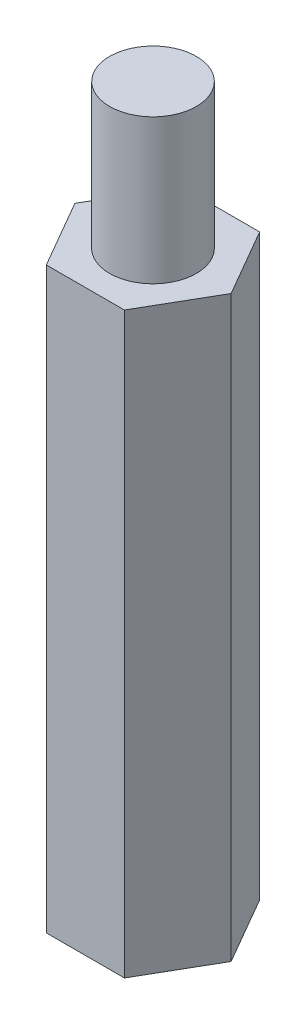
ISO-10303-21;
HEADER;
FILE_DESCRIPTION(('STEP AP214'),'2;1');
FILE_NAME('part.step','',(''),(''),'','','');
FILE_SCHEMA(('AUTOMOTIVE_DESIGN { 1 0 10303 214 1 1 1 1 }'));
ENDSEC;
DATA;
#1=APPLICATION_CONTEXT('core data for automotive mechanical design processes');
#2=APPLICATION_PROTOCOL_DEFINITION('international standard','automotive_design',2000,#1);
#3=PRODUCT_CONTEXT('',#1,'mechanical');
#4=PRODUCT('Part','Part','',(#3));
#5=PRODUCT_RELATED_PRODUCT_CATEGORY('part','',(#4));
#6=PRODUCT_DEFINITION_FORMATION('','',#4);
#7=PRODUCT_DEFINITION_CONTEXT('part definition',#1,'design');
#8=PRODUCT_DEFINITION('design','',#6,#7);
#9=PRODUCT_DEFINITION_SHAPE('','',#8);
#10=(LENGTH_UNIT() NAMED_UNIT(*) SI_UNIT(.MILLI.,.METRE.));
#11=(NAMED_UNIT(*) PLANE_ANGLE_UNIT() SI_UNIT($,.RADIAN.));
#12=(NAMED_UNIT(*) SI_UNIT($,.STERADIAN.) SOLID_ANGLE_UNIT());
#13=UNCERTAINTY_MEASURE_WITH_UNIT(LENGTH_MEASURE(1.E-05),#10,'distance_accuracy_value','');
#14=(GEOMETRIC_REPRESENTATION_CONTEXT(3) GLOBAL_UNCERTAINTY_ASSIGNED_CONTEXT((#13)) GLOBAL_UNIT_ASSIGNED_CONTEXT((#10,
#11,#12)) REPRESENTATION_CONTEXT('',''));
#15=CARTESIAN_POINT('',(0.,0.,0.));
#16=DIRECTION('',(0.,0.,1.));
#17=DIRECTION('',(1.,0.,0.));
#18=AXIS2_PLACEMENT_3D('',#15,#16,#17);
#19=CARTESIAN_POINT('',(1.35,20.,2.33826859021799));
#20=DIRECTION('',(-0.866025403784439,0.,-0.5));
#21=DIRECTION('',(-0.5,0.,0.866025403784439));
#22=AXIS2_PLACEMENT_3D('',#19,#20,#21);
#23=PLANE('',#22);
#24=DIRECTION('',(0.5,0.,-0.866025403784439));
#25=VECTOR('',#24,1.);
#26=CARTESIAN_POINT('',(1.35,0.,2.33826859021799));
#27=LINE('',#26,#25);
#28=CARTESIAN_POINT('',(1.35,0.,2.33826859021799));
#29=VERTEX_POINT('',#28);
#30=CARTESIAN_POINT('',(2.7,0.,0.));
#31=VERTEX_POINT('',#30);
#32=EDGE_CURVE('E123',#29,#31,#27,.T.);
#33=ORIENTED_EDGE('',*,*,#32,.T.);
#34=DIRECTION('',(0.,-1.,0.));
#35=VECTOR('',#34,1.);
#36=CARTESIAN_POINT('',(2.7,20.,0.));
#37=LINE('',#36,#35);
#38=CARTESIAN_POINT('',(2.7,20.,0.));
#39=VERTEX_POINT('',#38);
#40=EDGE_CURVE('E11',#39,#31,#37,.T.);
#41=ORIENTED_EDGE('',*,*,#40,.F.);
#42=DIRECTION('',(0.5,0.,-0.866025403784439));
#43=VECTOR('',#42,1.);
#44=CARTESIAN_POINT('',(1.35,20.,2.33826859021799));
#45=LINE('',#44,#43);
#46=CARTESIAN_POINT('',(1.35,20.,2.33826859021799));
#47=VERTEX_POINT('',#46);
#48=EDGE_CURVE('E134',#47,#39,#45,.T.);
#49=ORIENTED_EDGE('',*,*,#48,.F.);
#50=DIRECTION('',(0.,-1.,0.));
#51=VECTOR('',#50,1.);
#52=CARTESIAN_POINT('',(1.35,20.,2.33826859021799));
#53=LINE('',#52,#51);
#54=EDGE_CURVE('E119',#47,#29,#53,.T.);
#55=ORIENTED_EDGE('',*,*,#54,.T.);
#56=EDGE_LOOP('',(#33,#41,#49,#55));
#57=FACE_BOUND('',#56,.T.);
#58=ADVANCED_FACE('F38',(#57),#23,.F.);
#59=CARTESIAN_POINT('',(2.7,20.,0.));
#60=DIRECTION('',(-0.866025403784439,0.,0.5));
#61=DIRECTION('',(0.5,0.,0.866025403784439));
#62=AXIS2_PLACEMENT_3D('',#59,#60,#61);
#63=PLANE('',#62);
#64=DIRECTION('',(-0.5,0.,-0.866025403784438));
#65=VECTOR('',#64,1.);
#66=CARTESIAN_POINT('',(2.7,0.,0.));
#67=LINE('',#66,#65);
#68=CARTESIAN_POINT('',(1.35,0.,-2.33826859021799));
#69=VERTEX_POINT('',#68);
#70=EDGE_CURVE('E126',#31,#69,#67,.T.);
#71=ORIENTED_EDGE('',*,*,#70,.T.);
#72=DIRECTION('',(0.,-1.,0.));
#73=VECTOR('',#72,1.);
#74=CARTESIAN_POINT('',(1.35,20.,-2.33826859021799));
#75=LINE('',#74,#73);
#76=CARTESIAN_POINT('',(1.35,20.,-2.33826859021799));
#77=VERTEX_POINT('',#76);
#78=EDGE_CURVE('E47',#77,#69,#75,.T.);
#79=ORIENTED_EDGE('',*,*,#78,.F.);
#80=DIRECTION('',(-0.5,0.,-0.866025403784438));
#81=VECTOR('',#80,1.);
#82=CARTESIAN_POINT('',(2.7,20.,0.));
#83=LINE('',#82,#81);
#84=EDGE_CURVE('E92',#39,#77,#83,.T.);
#85=ORIENTED_EDGE('',*,*,#84,.F.);
#86=ORIENTED_EDGE('',*,*,#40,.T.);
#87=EDGE_LOOP('',(#71,#79,#85,#86));
#88=FACE_BOUND('',#87,.T.);
#89=ADVANCED_FACE('F160',(#88),#63,.F.);
#90=CARTESIAN_POINT('',(1.35,20.,-2.33826859021799));
#91=DIRECTION('',(0.,0.,1.));
#92=DIRECTION('',(1.,0.,0.));
#93=AXIS2_PLACEMENT_3D('',#90,#91,#92);
#94=PLANE('',#93);
#95=DIRECTION('',(-1.,0.,0.));
#96=VECTOR('',#95,1.);
#97=CARTESIAN_POINT('',(1.35,0.,-2.33826859021799));
#98=LINE('',#97,#96);
#99=CARTESIAN_POINT('',(-1.35,0.,-2.33826859021799));
#100=VERTEX_POINT('',#99);
#101=EDGE_CURVE('E129',#69,#100,#98,.T.);
#102=ORIENTED_EDGE('',*,*,#101,.T.);
#103=DIRECTION('',(0.,-1.,0.));
#104=VECTOR('',#103,1.);
#105=CARTESIAN_POINT('',(-1.35,20.,-2.33826859021799));
#106=LINE('',#105,#104);
#107=CARTESIAN_POINT('',(-1.35,20.,-2.33826859021799));
#108=VERTEX_POINT('',#107);
#109=EDGE_CURVE('E114',#108,#100,#106,.T.);
#110=ORIENTED_EDGE('',*,*,#109,.F.);
#111=DIRECTION('',(-1.,0.,0.));
#112=VECTOR('',#111,1.);
#113=CARTESIAN_POINT('',(1.35,20.,-2.33826859021799));
#114=LINE('',#113,#112);
#115=EDGE_CURVE('E105',#77,#108,#114,.T.);
#116=ORIENTED_EDGE('',*,*,#115,.F.);
#117=ORIENTED_EDGE('',*,*,#78,.T.);
#118=EDGE_LOOP('',(#102,#110,#116,#117));
#119=FACE_BOUND('',#118,.T.);
#120=ADVANCED_FACE('F141',(#119),#94,.F.);
#121=CARTESIAN_POINT('',(-1.35,20.,-2.33826859021799));
#122=DIRECTION('',(0.866025403784439,0.,0.5));
#123=DIRECTION('',(0.5,0.,-0.866025403784439));
#124=AXIS2_PLACEMENT_3D('',#121,#122,#123);
#125=PLANE('',#124);
#126=DIRECTION('',(-0.5,0.,0.866025403784439));
#127=VECTOR('',#126,1.);
#128=CARTESIAN_POINT('',(-1.35,0.,-2.33826859021799));
#129=LINE('',#128,#127);
#130=CARTESIAN_POINT('',(-2.7,0.,0.));
#131=VERTEX_POINT('',#130);
#132=EDGE_CURVE('E113',#100,#131,#129,.T.);
#133=ORIENTED_EDGE('',*,*,#132,.T.);
#134=DIRECTION('',(0.,-1.,0.));
#135=VECTOR('',#134,1.);
#136=CARTESIAN_POINT('',(-2.7,20.,0.));
#137=LINE('',#136,#135);
#138=CARTESIAN_POINT('',(-2.7,20.,0.));
#139=VERTEX_POINT('',#138);
#140=EDGE_CURVE('E110',#139,#131,#137,.T.);
#141=ORIENTED_EDGE('',*,*,#140,.F.);
#142=DIRECTION('',(-0.5,0.,0.866025403784439));
#143=VECTOR('',#142,1.);
#144=CARTESIAN_POINT('',(-1.35,20.,-2.33826859021799));
#145=LINE('',#144,#143);
#146=EDGE_CURVE('E99',#108,#139,#145,.T.);
#147=ORIENTED_EDGE('',*,*,#146,.F.);
#148=ORIENTED_EDGE('',*,*,#109,.T.);
#149=EDGE_LOOP('',(#133,#141,#147,#148));
#150=FACE_BOUND('',#149,.T.);
#151=ADVANCED_FACE('F111',(#150),#125,.F.);
#152=CARTESIAN_POINT('',(-2.7,20.,0.));
#153=DIRECTION('',(0.866025403784439,0.,-0.5));
#154=DIRECTION('',(-0.5,0.,-0.866025403784439));
#155=AXIS2_PLACEMENT_3D('',#152,#153,#154);
#156=PLANE('',#155);
#157=DIRECTION('',(0.5,0.,0.866025403784439));
#158=VECTOR('',#157,1.);
#159=CARTESIAN_POINT('',(-2.7,0.,0.));
#160=LINE('',#159,#158);
#161=CARTESIAN_POINT('',(-1.35,0.,2.33826859021799));
#162=VERTEX_POINT('',#161);
#163=EDGE_CURVE('E78',#131,#162,#160,.T.);
#164=ORIENTED_EDGE('',*,*,#163,.T.);
#165=DIRECTION('',(0.,-1.,0.));
#166=VECTOR('',#165,1.);
#167=CARTESIAN_POINT('',(-1.35,20.,2.33826859021799));
#168=LINE('',#167,#166);
#169=CARTESIAN_POINT('',(-1.35,20.,2.33826859021799));
#170=VERTEX_POINT('',#169);
#171=EDGE_CURVE('E115',#170,#162,#168,.T.);
#172=ORIENTED_EDGE('',*,*,#171,.F.);
#173=DIRECTION('',(0.5,0.,0.866025403784439));
#174=VECTOR('',#173,1.);
#175=CARTESIAN_POINT('',(-2.7,20.,0.));
#176=LINE('',#175,#174);
#177=EDGE_CURVE('E103',#139,#170,#176,.T.);
#178=ORIENTED_EDGE('',*,*,#177,.F.);
#179=ORIENTED_EDGE('',*,*,#140,.T.);
#180=EDGE_LOOP('',(#164,#172,#178,#179));
#181=FACE_BOUND('',#180,.T.);
#182=ADVANCED_FACE('F117',(#181),#156,.F.);
#183=CARTESIAN_POINT('',(-1.35,20.,2.33826859021799));
#184=DIRECTION('',(0.,0.,-1.));
#185=DIRECTION('',(-1.,0.,0.));
#186=AXIS2_PLACEMENT_3D('',#183,#184,#185);
#187=PLANE('',#186);
#188=DIRECTION('',(1.,0.,0.));
#189=VECTOR('',#188,1.);
#190=CARTESIAN_POINT('',(-1.35,0.,2.33826859021799));
#191=LINE('',#190,#189);
#192=EDGE_CURVE('E84',#162,#29,#191,.T.);
#193=ORIENTED_EDGE('',*,*,#192,.T.);
#194=ORIENTED_EDGE('',*,*,#54,.F.);
#195=DIRECTION('',(1.,0.,0.));
#196=VECTOR('',#195,1.);
#197=CARTESIAN_POINT('',(-1.35,20.,2.33826859021799));
#198=LINE('',#197,#196);
#199=EDGE_CURVE('E55',#170,#47,#198,.T.);
#200=ORIENTED_EDGE('',*,*,#199,.F.);
#201=ORIENTED_EDGE('',*,*,#171,.T.);
#202=EDGE_LOOP('',(#193,#194,#200,#201));
#203=FACE_BOUND('',#202,.T.);
#204=ADVANCED_FACE('F148',(#203),#187,.F.);
#205=CARTESIAN_POINT('',(0.,20.,0.));
#206=DIRECTION('',(0.,1.,0.));
#207=DIRECTION('',(0.,0.,1.));
#208=AXIS2_PLACEMENT_3D('',#205,#206,#207);
#209=PLANE('',#208);
#210=CARTESIAN_POINT('',(0.,20.,0.));
#211=DIRECTION('',(0.,1.,0.));
#212=DIRECTION('',(0.,0.,1.));
#213=AXIS2_PLACEMENT_3D('',#210,#211,#212);
#214=CIRCLE('',#213,1.5);
#215=CARTESIAN_POINT('',(0.,20.,1.5));
#216=VERTEX_POINT('',#215);
#217=EDGE_CURVE('E127',#216,#216,#214,.F.);
#218=ORIENTED_EDGE('',*,*,#217,.T.);
#219=EDGE_LOOP('',(#218));
#220=FACE_BOUND('',#219,.T.);
#221=ORIENTED_EDGE('',*,*,#48,.T.);
#222=ORIENTED_EDGE('',*,*,#84,.T.);
#223=ORIENTED_EDGE('',*,*,#115,.T.);
#224=ORIENTED_EDGE('',*,*,#146,.T.);
#225=ORIENTED_EDGE('',*,*,#177,.T.);
#226=ORIENTED_EDGE('',*,*,#199,.T.);
#227=EDGE_LOOP('',(#221,#222,#223,#224,#225,#226));
#228=FACE_BOUND('',#227,.T.);
#229=ADVANCED_FACE('F101',(#220,#228),#209,.T.);
#230=CARTESIAN_POINT('',(0.,0.,0.));
#231=DIRECTION('',(0.,1.,0.));
#232=DIRECTION('',(0.,0.,1.));
#233=AXIS2_PLACEMENT_3D('',#230,#231,#232);
#234=PLANE('',#233);
#235=CARTESIAN_POINT('',(0.,0.,0.));
#236=DIRECTION('',(0.,1.,0.));
#237=DIRECTION('',(0.,0.,1.));
#238=AXIS2_PLACEMENT_3D('',#235,#236,#237);
#239=CIRCLE('',#238,1.5);
#240=CARTESIAN_POINT('',(0.,0.,1.5));
#241=VERTEX_POINT('',#240);
#242=EDGE_CURVE('E41',#241,#241,#239,.F.);
#243=ORIENTED_EDGE('',*,*,#242,.F.);
#244=EDGE_LOOP('',(#243));
#245=FACE_BOUND('',#244,.T.);
#246=ORIENTED_EDGE('',*,*,#32,.F.);
#247=ORIENTED_EDGE('',*,*,#192,.F.);
#248=ORIENTED_EDGE('',*,*,#163,.F.);
#249=ORIENTED_EDGE('',*,*,#132,.F.);
#250=ORIENTED_EDGE('',*,*,#101,.F.);
#251=ORIENTED_EDGE('',*,*,#70,.F.);
#252=EDGE_LOOP('',(#246,#247,#248,#249,#250,#251));
#253=FACE_BOUND('',#252,.T.);
#254=ADVANCED_FACE('F144',(#245,#253),#234,.F.);
#255=CARTESIAN_POINT('',(0.,25.,0.));
#256=DIRECTION('',(0.,-1.,0.));
#257=DIRECTION('',(0.,0.,-1.));
#258=AXIS2_PLACEMENT_3D('',#255,#256,#257);
#259=CYLINDRICAL_SURFACE('',#258,1.5);
#260=ORIENTED_EDGE('',*,*,#217,.F.);
#261=EDGE_LOOP('',(#260));
#262=FACE_BOUND('',#261,.T.);
#263=CARTESIAN_POINT('',(0.,25.,0.));
#264=DIRECTION('',(0.,1.,0.));
#265=DIRECTION('',(0.,0.,1.));
#266=AXIS2_PLACEMENT_3D('',#263,#264,#265);
#267=CIRCLE('',#266,1.5);
#268=CARTESIAN_POINT('',(0.,25.,1.5));
#269=VERTEX_POINT('',#268);
#270=EDGE_CURVE('E283',#269,#269,#267,.T.);
#271=ORIENTED_EDGE('',*,*,#270,.F.);
#272=EDGE_LOOP('',(#271));
#273=FACE_BOUND('',#272,.T.);
#274=ADVANCED_FACE('F198',(#262,#273),#259,.T.);
#275=CARTESIAN_POINT('',(0.,25.,0.));
#276=DIRECTION('',(0.,1.,0.));
#277=DIRECTION('',(0.,0.,1.));
#278=AXIS2_PLACEMENT_3D('',#275,#276,#277);
#279=PLANE('',#278);
#280=ORIENTED_EDGE('',*,*,#270,.T.);
#281=EDGE_LOOP('',(#280));
#282=FACE_BOUND('',#281,.T.);
#283=ADVANCED_FACE('F203',(#282),#279,.T.);
#284=CARTESIAN_POINT('',(0.,5.,0.));
#285=DIRECTION('',(0.,-1.,0.));
#286=DIRECTION('',(0.,0.,-1.));
#287=AXIS2_PLACEMENT_3D('',#284,#285,#286);
#288=CYLINDRICAL_SURFACE('',#287,1.5);
#289=CARTESIAN_POINT('',(0.,5.,0.));
#290=DIRECTION('',(0.,1.,0.));
#291=DIRECTION('',(0.,0.,1.));
#292=AXIS2_PLACEMENT_3D('',#289,#290,#291);
#293=CIRCLE('',#292,1.5);
#294=CARTESIAN_POINT('',(0.,5.,1.5));
#295=VERTEX_POINT('',#294);
#296=EDGE_CURVE('E280',#295,#295,#293,.T.);
#297=ORIENTED_EDGE('',*,*,#296,.T.);
#298=EDGE_LOOP('',(#297));
#299=FACE_BOUND('',#298,.T.);
#300=ORIENTED_EDGE('',*,*,#242,.T.);
#301=EDGE_LOOP('',(#300));
#302=FACE_BOUND('',#301,.T.);
#303=ADVANCED_FACE('F214',(#299,#302),#288,.F.);
#304=CARTESIAN_POINT('',(0.,5.,0.));
#305=DIRECTION('',(0.,1.,0.));
#306=DIRECTION('',(0.,0.,1.));
#307=AXIS2_PLACEMENT_3D('',#304,#305,#306);
#308=PLANE('',#307);
#309=ORIENTED_EDGE('',*,*,#296,.F.);
#310=EDGE_LOOP('',(#309));
#311=FACE_BOUND('',#310,.T.);
#312=ADVANCED_FACE('F232',(#311),#308,.F.);
#313=CLOSED_SHELL('',(#58,#89,#120,#151,#182,#204,#229,#254,#274,#283,#303,#312));
#314=MANIFOLD_SOLID_BREP('B2',#313);
#315=ADVANCED_BREP_SHAPE_REPRESENTATION('',(#18,#314),#14);
#316=SHAPE_DEFINITION_REPRESENTATION(#9,#315);
ENDSEC;
END-ISO-10303-21;
